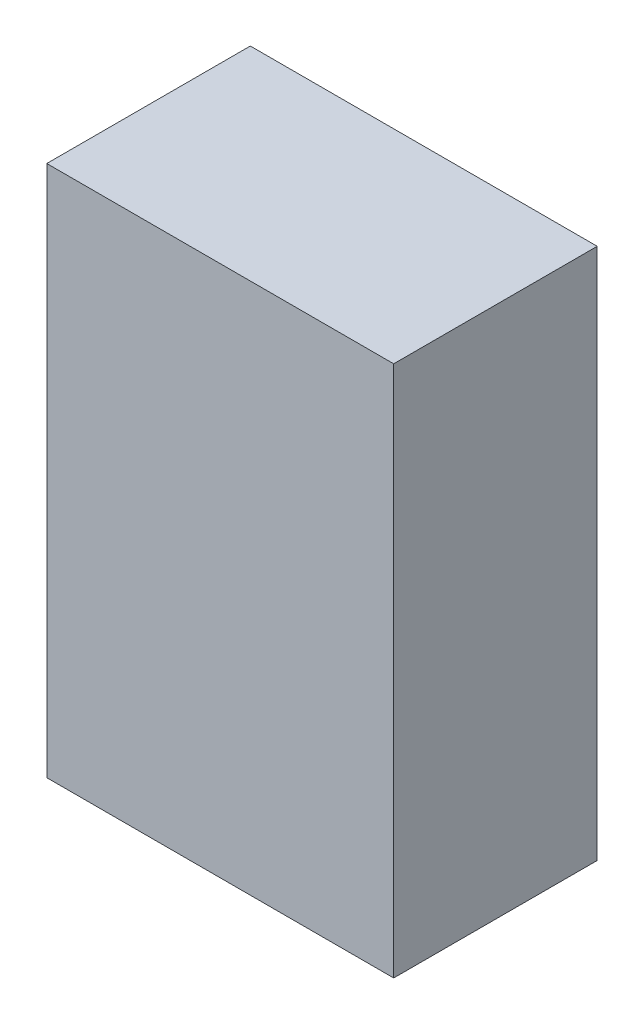
ISO-10303-21;
HEADER;
FILE_DESCRIPTION(('STEP AP214'),'2;1');
FILE_NAME('part.step','',(''),(''),'','','');
FILE_SCHEMA(('AUTOMOTIVE_DESIGN { 1 0 10303 214 1 1 1 1 }'));
ENDSEC;
DATA;
#1=APPLICATION_CONTEXT('core data for automotive mechanical design processes');
#2=APPLICATION_PROTOCOL_DEFINITION('international standard','automotive_design',2000,#1);
#3=PRODUCT_CONTEXT('',#1,'mechanical');
#4=PRODUCT('Part','Part','',(#3));
#5=PRODUCT_RELATED_PRODUCT_CATEGORY('part','',(#4));
#6=PRODUCT_DEFINITION_FORMATION('','',#4);
#7=PRODUCT_DEFINITION_CONTEXT('part definition',#1,'design');
#8=PRODUCT_DEFINITION('design','',#6,#7);
#9=PRODUCT_DEFINITION_SHAPE('','',#8);
#10=(LENGTH_UNIT() NAMED_UNIT(*) SI_UNIT(.MILLI.,.METRE.));
#11=(NAMED_UNIT(*) PLANE_ANGLE_UNIT() SI_UNIT($,.RADIAN.));
#12=(NAMED_UNIT(*) SI_UNIT($,.STERADIAN.) SOLID_ANGLE_UNIT());
#13=UNCERTAINTY_MEASURE_WITH_UNIT(LENGTH_MEASURE(1.E-05),#10,'distance_accuracy_value','');
#14=(GEOMETRIC_REPRESENTATION_CONTEXT(3) GLOBAL_UNCERTAINTY_ASSIGNED_CONTEXT((#13)) GLOBAL_UNIT_ASSIGNED_CONTEXT((#10,
#11,#12)) REPRESENTATION_CONTEXT('',''));
#15=CARTESIAN_POINT('',(0.,0.,0.));
#16=DIRECTION('',(0.,0.,1.));
#17=DIRECTION('',(1.,0.,0.));
#18=AXIS2_PLACEMENT_3D('',#15,#16,#17);
#19=CARTESIAN_POINT('',(15.,46.,-8.8));
#20=DIRECTION('',(-1.,0.,0.));
#21=DIRECTION('',(0.,0.,1.));
#22=AXIS2_PLACEMENT_3D('',#19,#20,#21);
#23=PLANE('',#22);
#24=DIRECTION('',(0.,0.,-1.));
#25=VECTOR('',#24,1.);
#26=CARTESIAN_POINT('',(15.,0.,-8.8));
#27=LINE('',#26,#25);
#28=CARTESIAN_POINT('',(15.,0.,8.8));
#29=VERTEX_POINT('',#28);
#30=CARTESIAN_POINT('',(15.,0.,-8.8));
#31=VERTEX_POINT('',#30);
#32=EDGE_CURVE('E109',#29,#31,#27,.T.);
#33=ORIENTED_EDGE('',*,*,#32,.T.);
#34=DIRECTION('',(0.,-1.,0.));
#35=VECTOR('',#34,1.);
#36=CARTESIAN_POINT('',(15.,46.,-8.8));
#37=LINE('',#36,#35);
#38=CARTESIAN_POINT('',(15.,46.,-8.8));
#39=VERTEX_POINT('',#38);
#40=EDGE_CURVE('E11',#39,#31,#37,.T.);
#41=ORIENTED_EDGE('',*,*,#40,.F.);
#42=DIRECTION('',(0.,0.,-1.));
#43=VECTOR('',#42,1.);
#44=CARTESIAN_POINT('',(15.,46.,-8.8));
#45=LINE('',#44,#43);
#46=CARTESIAN_POINT('',(15.,46.,8.8));
#47=VERTEX_POINT('',#46);
#48=EDGE_CURVE('E93',#47,#39,#45,.T.);
#49=ORIENTED_EDGE('',*,*,#48,.F.);
#50=DIRECTION('',(0.,-1.,0.));
#51=VECTOR('',#50,1.);
#52=CARTESIAN_POINT('',(15.,46.,8.8));
#53=LINE('',#52,#51);
#54=EDGE_CURVE('E105',#47,#29,#53,.T.);
#55=ORIENTED_EDGE('',*,*,#54,.T.);
#56=EDGE_LOOP('',(#33,#41,#49,#55));
#57=FACE_BOUND('',#56,.T.);
#58=ADVANCED_FACE('F41',(#57),#23,.F.);
#59=CARTESIAN_POINT('',(-15.,46.,-8.8));
#60=DIRECTION('',(0.,0.,1.));
#61=DIRECTION('',(1.,0.,0.));
#62=AXIS2_PLACEMENT_3D('',#59,#60,#61);
#63=PLANE('',#62);
#64=DIRECTION('',(-1.,0.,0.));
#65=VECTOR('',#64,1.);
#66=CARTESIAN_POINT('',(-15.,0.,-8.8));
#67=LINE('',#66,#65);
#68=CARTESIAN_POINT('',(-15.,0.,-8.8));
#69=VERTEX_POINT('',#68);
#70=EDGE_CURVE('E98',#31,#69,#67,.T.);
#71=ORIENTED_EDGE('',*,*,#70,.T.);
#72=DIRECTION('',(0.,-1.,0.));
#73=VECTOR('',#72,1.);
#74=CARTESIAN_POINT('',(-15.,46.,-8.8));
#75=LINE('',#74,#73);
#76=CARTESIAN_POINT('',(-15.,46.,-8.8));
#77=VERTEX_POINT('',#76);
#78=EDGE_CURVE('E50',#77,#69,#75,.T.);
#79=ORIENTED_EDGE('',*,*,#78,.F.);
#80=DIRECTION('',(-1.,0.,0.));
#81=VECTOR('',#80,1.);
#82=CARTESIAN_POINT('',(-15.,46.,-8.8));
#83=LINE('',#82,#81);
#84=EDGE_CURVE('E88',#39,#77,#83,.T.);
#85=ORIENTED_EDGE('',*,*,#84,.F.);
#86=ORIENTED_EDGE('',*,*,#40,.T.);
#87=EDGE_LOOP('',(#71,#79,#85,#86));
#88=FACE_BOUND('',#87,.T.);
#89=ADVANCED_FACE('F97',(#88),#63,.F.);
#90=CARTESIAN_POINT('',(-15.,46.,-8.8));
#91=DIRECTION('',(1.,0.,0.));
#92=DIRECTION('',(0.,0.,-1.));
#93=AXIS2_PLACEMENT_3D('',#90,#91,#92);
#94=PLANE('',#93);
#95=DIRECTION('',(0.,0.,1.));
#96=VECTOR('',#95,1.);
#97=CARTESIAN_POINT('',(-15.,0.,-8.8));
#98=LINE('',#97,#96);
#99=CARTESIAN_POINT('',(-15.,0.,8.8));
#100=VERTEX_POINT('',#99);
#101=EDGE_CURVE('E75',#69,#100,#98,.T.);
#102=ORIENTED_EDGE('',*,*,#101,.T.);
#103=DIRECTION('',(0.,-1.,0.));
#104=VECTOR('',#103,1.);
#105=CARTESIAN_POINT('',(-15.,46.,8.8));
#106=LINE('',#105,#104);
#107=CARTESIAN_POINT('',(-15.,46.,8.8));
#108=VERTEX_POINT('',#107);
#109=EDGE_CURVE('E100',#108,#100,#106,.T.);
#110=ORIENTED_EDGE('',*,*,#109,.F.);
#111=DIRECTION('',(0.,0.,1.));
#112=VECTOR('',#111,1.);
#113=CARTESIAN_POINT('',(-15.,46.,-8.8));
#114=LINE('',#113,#112);
#115=EDGE_CURVE('E91',#77,#108,#114,.T.);
#116=ORIENTED_EDGE('',*,*,#115,.F.);
#117=ORIENTED_EDGE('',*,*,#78,.T.);
#118=EDGE_LOOP('',(#102,#110,#116,#117));
#119=FACE_BOUND('',#118,.T.);
#120=ADVANCED_FACE('F101',(#119),#94,.F.);
#121=CARTESIAN_POINT('',(-15.,46.,8.8));
#122=DIRECTION('',(0.,0.,-1.));
#123=DIRECTION('',(-1.,0.,0.));
#124=AXIS2_PLACEMENT_3D('',#121,#122,#123);
#125=PLANE('',#124);
#126=DIRECTION('',(1.,0.,0.));
#127=VECTOR('',#126,1.);
#128=CARTESIAN_POINT('',(-15.,0.,8.8));
#129=LINE('',#128,#127);
#130=EDGE_CURVE('E81',#100,#29,#129,.T.);
#131=ORIENTED_EDGE('',*,*,#130,.T.);
#132=ORIENTED_EDGE('',*,*,#54,.F.);
#133=DIRECTION('',(1.,0.,0.));
#134=VECTOR('',#133,1.);
#135=CARTESIAN_POINT('',(-15.,46.,8.8));
#136=LINE('',#135,#134);
#137=EDGE_CURVE('E58',#108,#47,#136,.T.);
#138=ORIENTED_EDGE('',*,*,#137,.F.);
#139=ORIENTED_EDGE('',*,*,#109,.T.);
#140=EDGE_LOOP('',(#131,#132,#138,#139));
#141=FACE_BOUND('',#140,.T.);
#142=ADVANCED_FACE('F122',(#141),#125,.F.);
#143=CARTESIAN_POINT('',(0.,46.,0.));
#144=DIRECTION('',(0.,1.,0.));
#145=DIRECTION('',(0.,0.,1.));
#146=AXIS2_PLACEMENT_3D('',#143,#144,#145);
#147=PLANE('',#146);
#148=ORIENTED_EDGE('',*,*,#48,.T.);
#149=ORIENTED_EDGE('',*,*,#84,.T.);
#150=ORIENTED_EDGE('',*,*,#115,.T.);
#151=ORIENTED_EDGE('',*,*,#137,.T.);
#152=EDGE_LOOP('',(#148,#149,#150,#151));
#153=FACE_BOUND('',#152,.T.);
#154=ADVANCED_FACE('F89',(#153),#147,.T.);
#155=CARTESIAN_POINT('',(0.,0.,0.));
#156=DIRECTION('',(0.,1.,0.));
#157=DIRECTION('',(0.,0.,1.));
#158=AXIS2_PLACEMENT_3D('',#155,#156,#157);
#159=PLANE('',#158);
#160=ORIENTED_EDGE('',*,*,#32,.F.);
#161=ORIENTED_EDGE('',*,*,#130,.F.);
#162=ORIENTED_EDGE('',*,*,#101,.F.);
#163=ORIENTED_EDGE('',*,*,#70,.F.);
#164=EDGE_LOOP('',(#160,#161,#162,#163));
#165=FACE_BOUND('',#164,.T.);
#166=ADVANCED_FACE('F125',(#165),#159,.F.);
#167=CLOSED_SHELL('',(#58,#89,#120,#142,#154,#166));
#168=MANIFOLD_SOLID_BREP('B2',#167);
#169=ADVANCED_BREP_SHAPE_REPRESENTATION('',(#18,#168),#14);
#170=SHAPE_DEFINITION_REPRESENTATION(#9,#169);
ENDSEC;
END-ISO-10303-21;
